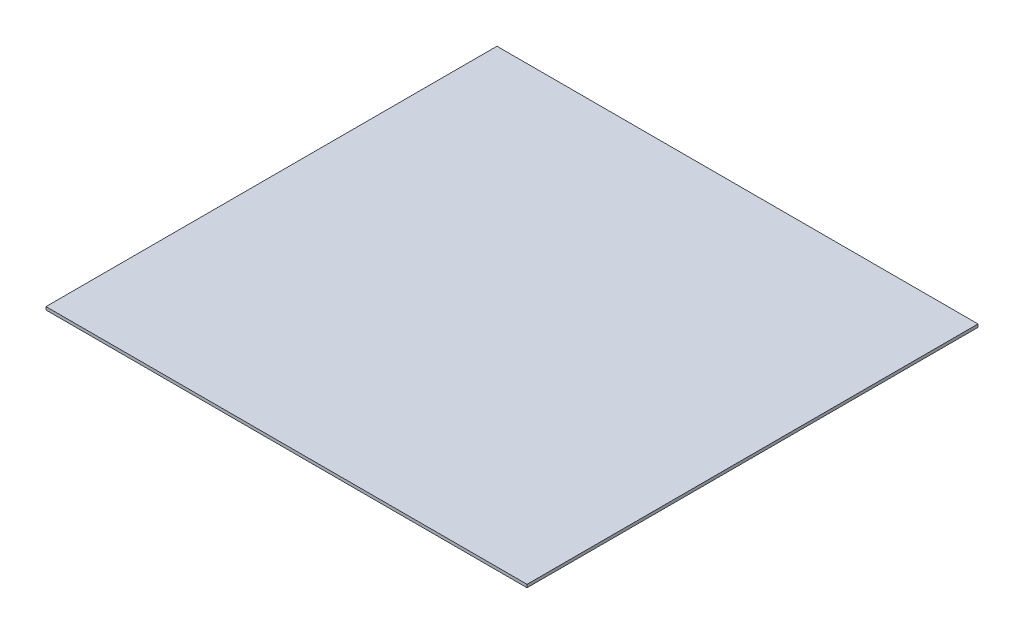
ISO-10303-21;
HEADER;
FILE_DESCRIPTION(('STEP AP214'),'2;1');
FILE_NAME('part.step','',(''),(''),'','','');
FILE_SCHEMA(('AUTOMOTIVE_DESIGN { 1 0 10303 214 1 1 1 1 }'));
ENDSEC;
DATA;
#1=APPLICATION_CONTEXT('core data for automotive mechanical design processes');
#2=APPLICATION_PROTOCOL_DEFINITION('international standard','automotive_design',2000,#1);
#3=PRODUCT_CONTEXT('',#1,'mechanical');
#4=PRODUCT('Part','Part','',(#3));
#5=PRODUCT_RELATED_PRODUCT_CATEGORY('part','',(#4));
#6=PRODUCT_DEFINITION_FORMATION('','',#4);
#7=PRODUCT_DEFINITION_CONTEXT('part definition',#1,'design');
#8=PRODUCT_DEFINITION('design','',#6,#7);
#9=PRODUCT_DEFINITION_SHAPE('','',#8);
#10=(LENGTH_UNIT() NAMED_UNIT(*) SI_UNIT(.MILLI.,.METRE.));
#11=(NAMED_UNIT(*) PLANE_ANGLE_UNIT() SI_UNIT($,.RADIAN.));
#12=(NAMED_UNIT(*) SI_UNIT($,.STERADIAN.) SOLID_ANGLE_UNIT());
#13=UNCERTAINTY_MEASURE_WITH_UNIT(LENGTH_MEASURE(1.E-05),#10,'distance_accuracy_value','');
#14=(GEOMETRIC_REPRESENTATION_CONTEXT(3) GLOBAL_UNCERTAINTY_ASSIGNED_CONTEXT((#13)) GLOBAL_UNIT_ASSIGNED_CONTEXT((#10,
#11,#12)) REPRESENTATION_CONTEXT('',''));
#15=CARTESIAN_POINT('',(0.,0.,0.));
#16=DIRECTION('',(0.,0.,1.));
#17=DIRECTION('',(1.,0.,0.));
#18=AXIS2_PLACEMENT_3D('',#15,#16,#17);
#19=CARTESIAN_POINT('',(406.4,5.08,381.));
#20=DIRECTION('',(-1.,0.,0.));
#21=DIRECTION('',(0.,0.,1.));
#22=AXIS2_PLACEMENT_3D('',#19,#20,#21);
#23=PLANE('',#22);
#24=DIRECTION('',(0.,0.,-1.));
#25=VECTOR('',#24,1.);
#26=CARTESIAN_POINT('',(406.4,0.,381.));
#27=LINE('',#26,#25);
#28=CARTESIAN_POINT('',(406.4,0.,381.));
#29=VERTEX_POINT('',#28);
#30=CARTESIAN_POINT('',(406.4,0.,-381.));
#31=VERTEX_POINT('',#30);
#32=EDGE_CURVE('E95',#29,#31,#27,.T.);
#33=ORIENTED_EDGE('',*,*,#32,.T.);
#34=DIRECTION('',(0.,-1.,0.));
#35=VECTOR('',#34,1.);
#36=CARTESIAN_POINT('',(406.4,5.08,-381.));
#37=LINE('',#36,#35);
#38=CARTESIAN_POINT('',(406.4,5.08,-381.));
#39=VERTEX_POINT('',#38);
#40=EDGE_CURVE('E11',#39,#31,#37,.T.);
#41=ORIENTED_EDGE('',*,*,#40,.F.);
#42=DIRECTION('',(0.,0.,-1.));
#43=VECTOR('',#42,1.);
#44=CARTESIAN_POINT('',(406.4,5.08,381.));
#45=LINE('',#44,#43);
#46=CARTESIAN_POINT('',(406.4,5.08,381.));
#47=VERTEX_POINT('',#46);
#48=EDGE_CURVE('E83',#47,#39,#45,.T.);
#49=ORIENTED_EDGE('',*,*,#48,.F.);
#50=DIRECTION('',(0.,-1.,0.));
#51=VECTOR('',#50,1.);
#52=CARTESIAN_POINT('',(406.4,5.08,381.));
#53=LINE('',#52,#51);
#54=EDGE_CURVE('E91',#47,#29,#53,.T.);
#55=ORIENTED_EDGE('',*,*,#54,.T.);
#56=EDGE_LOOP('',(#33,#41,#49,#55));
#57=FACE_BOUND('',#56,.T.);
#58=ADVANCED_FACE('F32',(#57),#23,.F.);
#59=CARTESIAN_POINT('',(-406.4,5.08,-381.));
#60=DIRECTION('',(0.,0.,1.));
#61=DIRECTION('',(1.,0.,0.));
#62=AXIS2_PLACEMENT_3D('',#59,#60,#61);
#63=PLANE('',#62);
#64=DIRECTION('',(-1.,0.,0.));
#65=VECTOR('',#64,1.);
#66=CARTESIAN_POINT('',(-406.4,0.,-381.));
#67=LINE('',#66,#65);
#68=CARTESIAN_POINT('',(-406.4,0.,-381.));
#69=VERTEX_POINT('',#68);
#70=EDGE_CURVE('E87',#31,#69,#67,.T.);
#71=ORIENTED_EDGE('',*,*,#70,.T.);
#72=DIRECTION('',(0.,-1.,0.));
#73=VECTOR('',#72,1.);
#74=CARTESIAN_POINT('',(-406.4,5.08,-381.));
#75=LINE('',#74,#73);
#76=CARTESIAN_POINT('',(-406.4,5.08,-381.));
#77=VERTEX_POINT('',#76);
#78=EDGE_CURVE('E40',#77,#69,#75,.T.);
#79=ORIENTED_EDGE('',*,*,#78,.F.);
#80=DIRECTION('',(-1.,0.,0.));
#81=VECTOR('',#80,1.);
#82=CARTESIAN_POINT('',(-406.4,5.08,-381.));
#83=LINE('',#82,#81);
#84=EDGE_CURVE('E78',#39,#77,#83,.T.);
#85=ORIENTED_EDGE('',*,*,#84,.F.);
#86=ORIENTED_EDGE('',*,*,#40,.T.);
#87=EDGE_LOOP('',(#71,#79,#85,#86));
#88=FACE_BOUND('',#87,.T.);
#89=ADVANCED_FACE('F86',(#88),#63,.F.);
#90=CARTESIAN_POINT('',(-406.4,5.08,381.));
#91=DIRECTION('',(1.,0.,0.));
#92=DIRECTION('',(0.,0.,-1.));
#93=AXIS2_PLACEMENT_3D('',#90,#91,#92);
#94=PLANE('',#93);
#95=DIRECTION('',(0.,0.,1.));
#96=VECTOR('',#95,1.);
#97=CARTESIAN_POINT('',(-406.4,0.,381.));
#98=LINE('',#97,#96);
#99=CARTESIAN_POINT('',(-406.4,0.,381.));
#100=VERTEX_POINT('',#99);
#101=EDGE_CURVE('E65',#69,#100,#98,.T.);
#102=ORIENTED_EDGE('',*,*,#101,.T.);
#103=DIRECTION('',(0.,-1.,0.));
#104=VECTOR('',#103,1.);
#105=CARTESIAN_POINT('',(-406.4,5.08,381.));
#106=LINE('',#105,#104);
#107=CARTESIAN_POINT('',(-406.4,5.08,381.));
#108=VERTEX_POINT('',#107);
#109=EDGE_CURVE('E88',#108,#100,#106,.T.);
#110=ORIENTED_EDGE('',*,*,#109,.F.);
#111=DIRECTION('',(0.,0.,1.));
#112=VECTOR('',#111,1.);
#113=CARTESIAN_POINT('',(-406.4,5.08,381.));
#114=LINE('',#113,#112);
#115=EDGE_CURVE('E81',#77,#108,#114,.T.);
#116=ORIENTED_EDGE('',*,*,#115,.F.);
#117=ORIENTED_EDGE('',*,*,#78,.T.);
#118=EDGE_LOOP('',(#102,#110,#116,#117));
#119=FACE_BOUND('',#118,.T.);
#120=ADVANCED_FACE('F89',(#119),#94,.F.);
#121=CARTESIAN_POINT('',(-406.4,5.08,381.));
#122=DIRECTION('',(0.,0.,-1.));
#123=DIRECTION('',(-1.,0.,0.));
#124=AXIS2_PLACEMENT_3D('',#121,#122,#123);
#125=PLANE('',#124);
#126=DIRECTION('',(1.,0.,0.));
#127=VECTOR('',#126,1.);
#128=CARTESIAN_POINT('',(-406.4,0.,381.));
#129=LINE('',#128,#127);
#130=EDGE_CURVE('E71',#100,#29,#129,.T.);
#131=ORIENTED_EDGE('',*,*,#130,.T.);
#132=ORIENTED_EDGE('',*,*,#54,.F.);
#133=DIRECTION('',(1.,0.,0.));
#134=VECTOR('',#133,1.);
#135=CARTESIAN_POINT('',(-406.4,5.08,381.));
#136=LINE('',#135,#134);
#137=EDGE_CURVE('E48',#108,#47,#136,.T.);
#138=ORIENTED_EDGE('',*,*,#137,.F.);
#139=ORIENTED_EDGE('',*,*,#109,.T.);
#140=EDGE_LOOP('',(#131,#132,#138,#139));
#141=FACE_BOUND('',#140,.T.);
#142=ADVANCED_FACE('F102',(#141),#125,.F.);
#143=CARTESIAN_POINT('',(0.,5.08,0.));
#144=DIRECTION('',(0.,-1.,0.));
#145=DIRECTION('',(0.,0.,-1.));
#146=AXIS2_PLACEMENT_3D('',#143,#144,#145);
#147=PLANE('',#146);
#148=ORIENTED_EDGE('',*,*,#48,.T.);
#149=ORIENTED_EDGE('',*,*,#84,.T.);
#150=ORIENTED_EDGE('',*,*,#115,.T.);
#151=ORIENTED_EDGE('',*,*,#137,.T.);
#152=EDGE_LOOP('',(#148,#149,#150,#151));
#153=FACE_BOUND('',#152,.T.);
#154=ADVANCED_FACE('F79',(#153),#147,.F.);
#155=CARTESIAN_POINT('',(0.,0.,0.));
#156=DIRECTION('',(0.,-1.,0.));
#157=DIRECTION('',(0.,0.,-1.));
#158=AXIS2_PLACEMENT_3D('',#155,#156,#157);
#159=PLANE('',#158);
#160=ORIENTED_EDGE('',*,*,#32,.F.);
#161=ORIENTED_EDGE('',*,*,#130,.F.);
#162=ORIENTED_EDGE('',*,*,#101,.F.);
#163=ORIENTED_EDGE('',*,*,#70,.F.);
#164=EDGE_LOOP('',(#160,#161,#162,#163));
#165=FACE_BOUND('',#164,.T.);
#166=ADVANCED_FACE('F105',(#165),#159,.T.);
#167=CLOSED_SHELL('',(#58,#89,#120,#142,#154,#166));
#168=MANIFOLD_SOLID_BREP('B2',#167);
#169=ADVANCED_BREP_SHAPE_REPRESENTATION('',(#18,#168),#14);
#170=SHAPE_DEFINITION_REPRESENTATION(#9,#169);
ENDSEC;
END-ISO-10303-21;
